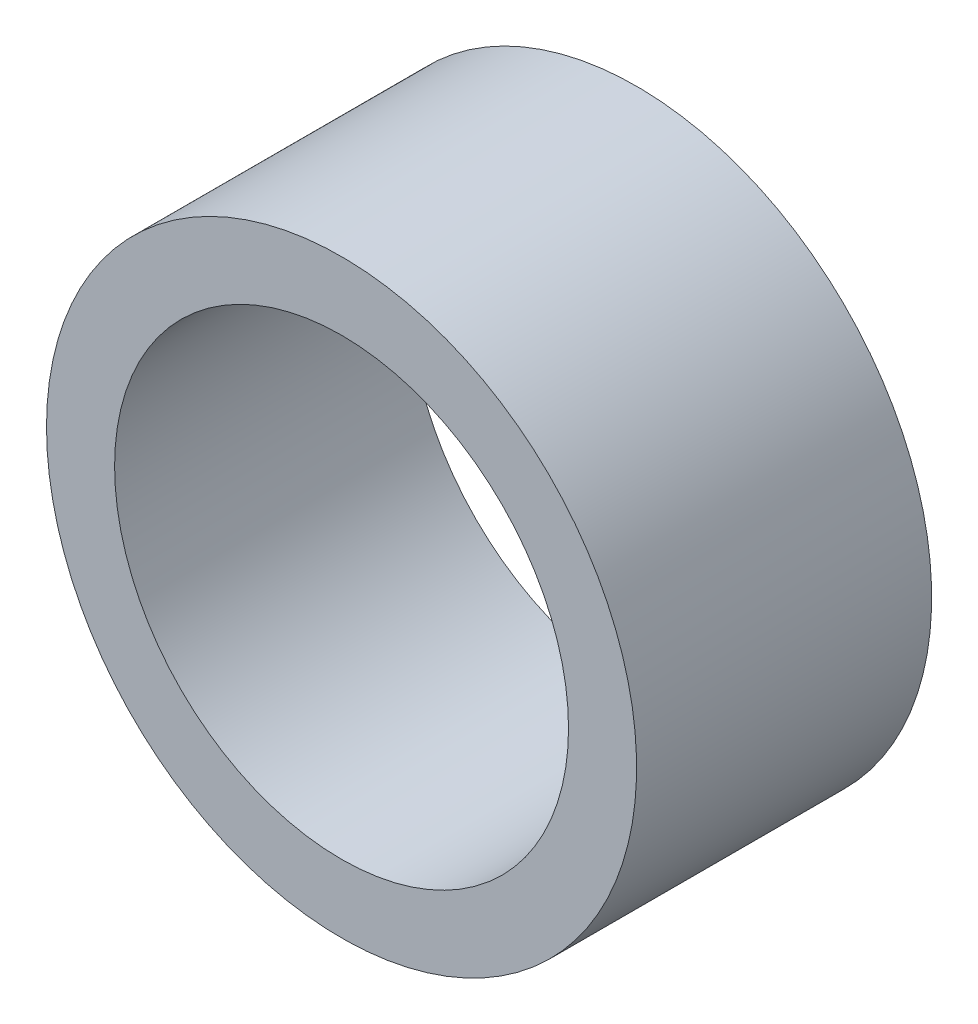
ISO-10303-21;
HEADER;
FILE_DESCRIPTION(('STEP AP214'),'2;1');
FILE_NAME('part.step','',(''),(''),'','','');
FILE_SCHEMA(('AUTOMOTIVE_DESIGN { 1 0 10303 214 1 1 1 1 }'));
ENDSEC;
DATA;
#1=APPLICATION_CONTEXT('core data for automotive mechanical design processes');
#2=APPLICATION_PROTOCOL_DEFINITION('international standard','automotive_design',2000,#1);
#3=PRODUCT_CONTEXT('',#1,'mechanical');
#4=PRODUCT('Part','Part','',(#3));
#5=PRODUCT_RELATED_PRODUCT_CATEGORY('part','',(#4));
#6=PRODUCT_DEFINITION_FORMATION('','',#4);
#7=PRODUCT_DEFINITION_CONTEXT('part definition',#1,'design');
#8=PRODUCT_DEFINITION('design','',#6,#7);
#9=PRODUCT_DEFINITION_SHAPE('','',#8);
#10=(LENGTH_UNIT() NAMED_UNIT(*) SI_UNIT(.MILLI.,.METRE.));
#11=(NAMED_UNIT(*) PLANE_ANGLE_UNIT() SI_UNIT($,.RADIAN.));
#12=(NAMED_UNIT(*) SI_UNIT($,.STERADIAN.) SOLID_ANGLE_UNIT());
#13=UNCERTAINTY_MEASURE_WITH_UNIT(LENGTH_MEASURE(1.E-05),#10,'distance_accuracy_value','');
#14=(GEOMETRIC_REPRESENTATION_CONTEXT(3) GLOBAL_UNCERTAINTY_ASSIGNED_CONTEXT((#13)) GLOBAL_UNIT_ASSIGNED_CONTEXT((#10,
#11,#12)) REPRESENTATION_CONTEXT('',''));
#15=CARTESIAN_POINT('',(0.,0.,0.));
#16=DIRECTION('',(0.,0.,1.));
#17=DIRECTION('',(1.,0.,0.));
#18=AXIS2_PLACEMENT_3D('',#15,#16,#17);
#19=CARTESIAN_POINT('',(0.,0.,26.));
#20=DIRECTION('',(0.,0.,1.));
#21=DIRECTION('',(1.,0.,0.));
#22=AXIS2_PLACEMENT_3D('',#19,#20,#21);
#23=PLANE('',#22);
#24=CARTESIAN_POINT('',(0.,0.,26.));
#25=DIRECTION('',(0.,0.,1.));
#26=DIRECTION('',(1.,0.,0.));
#27=AXIS2_PLACEMENT_3D('',#24,#25,#26);
#28=CIRCLE('',#27,26.);
#29=CARTESIAN_POINT('',(-26.,0.,26.));
#30=VERTEX_POINT('',#29);
#31=EDGE_CURVE('E10',#30,#30,#28,.T.);
#32=ORIENTED_EDGE('',*,*,#31,.T.);
#33=EDGE_LOOP('',(#32));
#34=FACE_BOUND('',#33,.T.);
#35=CARTESIAN_POINT('',(0.,0.,26.));
#36=DIRECTION('',(0.,0.,1.));
#37=DIRECTION('',(1.,0.,0.));
#38=AXIS2_PLACEMENT_3D('',#35,#36,#37);
#39=CIRCLE('',#38,20.);
#40=CARTESIAN_POINT('',(-20.,0.,26.));
#41=VERTEX_POINT('',#40);
#42=EDGE_CURVE('E42',#41,#41,#39,.T.);
#43=ORIENTED_EDGE('',*,*,#42,.F.);
#44=EDGE_LOOP('',(#43));
#45=FACE_BOUND('',#44,.T.);
#46=ADVANCED_FACE('F31',(#34,#45),#23,.T.);
#47=CARTESIAN_POINT('',(0.,0.,0.));
#48=DIRECTION('',(0.,0.,1.));
#49=DIRECTION('',(1.,0.,0.));
#50=AXIS2_PLACEMENT_3D('',#47,#48,#49);
#51=PLANE('',#50);
#52=CARTESIAN_POINT('',(0.,0.,0.));
#53=DIRECTION('',(0.,0.,1.));
#54=DIRECTION('',(1.,0.,0.));
#55=AXIS2_PLACEMENT_3D('',#52,#53,#54);
#56=CIRCLE('',#55,26.);
#57=CARTESIAN_POINT('',(-26.,0.,0.));
#58=VERTEX_POINT('',#57);
#59=EDGE_CURVE('E35',#58,#58,#56,.T.);
#60=ORIENTED_EDGE('',*,*,#59,.F.);
#61=EDGE_LOOP('',(#60));
#62=FACE_BOUND('',#61,.T.);
#63=CARTESIAN_POINT('',(0.,0.,0.));
#64=DIRECTION('',(0.,0.,1.));
#65=DIRECTION('',(1.,0.,0.));
#66=AXIS2_PLACEMENT_3D('',#63,#64,#65);
#67=CIRCLE('',#66,20.);
#68=CARTESIAN_POINT('',(-20.,0.,0.));
#69=VERTEX_POINT('',#68);
#70=EDGE_CURVE('E44',#69,#69,#67,.T.);
#71=ORIENTED_EDGE('',*,*,#70,.T.);
#72=EDGE_LOOP('',(#71));
#73=FACE_BOUND('',#72,.T.);
#74=ADVANCED_FACE('F54',(#62,#73),#51,.F.);
#75=CARTESIAN_POINT('',(0.,0.,26.));
#76=DIRECTION('',(0.,0.,-1.));
#77=DIRECTION('',(-1.,0.,0.));
#78=AXIS2_PLACEMENT_3D('',#75,#76,#77);
#79=CYLINDRICAL_SURFACE('',#78,26.);
#80=CARTESIAN_POINT('',(-26.,0.,26.));
#81=CARTESIAN_POINT('',(-26.,0.,25.7291666666667));
#82=CARTESIAN_POINT('',(-26.,0.,25.4583333333333));
#83=CARTESIAN_POINT('',(-26.,0.,24.9166666666667));
#84=CARTESIAN_POINT('',(-26.,0.,24.6458333333333));
#85=CARTESIAN_POINT('',(-26.,0.,24.1041666666667));
#86=CARTESIAN_POINT('',(-26.,0.,23.8333333333333));
#87=CARTESIAN_POINT('',(-26.,0.,23.2916666666667));
#88=CARTESIAN_POINT('',(-26.,0.,23.0208333333333));
#89=CARTESIAN_POINT('',(-26.,0.,22.4791666666667));
#90=CARTESIAN_POINT('',(-26.,0.,22.2083333333333));
#91=CARTESIAN_POINT('',(-26.,0.,21.6666666666667));
#92=CARTESIAN_POINT('',(-26.,0.,21.3958333333333));
#93=CARTESIAN_POINT('',(-26.,0.,20.8541666666667));
#94=CARTESIAN_POINT('',(-26.,0.,20.5833333333333));
#95=CARTESIAN_POINT('',(-26.,0.,20.0416666666667));
#96=CARTESIAN_POINT('',(-26.,0.,19.7708333333333));
#97=CARTESIAN_POINT('',(-26.,0.,19.2291666666667));
#98=CARTESIAN_POINT('',(-26.,0.,18.9583333333333));
#99=CARTESIAN_POINT('',(-26.,0.,18.4166666666667));
#100=CARTESIAN_POINT('',(-26.,0.,18.1458333333333));
#101=CARTESIAN_POINT('',(-26.,0.,17.6041666666667));
#102=CARTESIAN_POINT('',(-26.,0.,17.3333333333333));
#103=CARTESIAN_POINT('',(-26.,0.,16.7916666666667));
#104=CARTESIAN_POINT('',(-26.,0.,16.5208333333333));
#105=CARTESIAN_POINT('',(-26.,0.,15.9791666666667));
#106=CARTESIAN_POINT('',(-26.,0.,15.7083333333333));
#107=CARTESIAN_POINT('',(-26.,0.,15.1666666666667));
#108=CARTESIAN_POINT('',(-26.,0.,14.8958333333333));
#109=CARTESIAN_POINT('',(-26.,0.,14.3541666666667));
#110=CARTESIAN_POINT('',(-26.,0.,14.0833333333333));
#111=CARTESIAN_POINT('',(-26.,0.,13.5416666666667));
#112=CARTESIAN_POINT('',(-26.,0.,13.2708333333333));
#113=CARTESIAN_POINT('',(-26.,0.,12.7291666666667));
#114=CARTESIAN_POINT('',(-26.,0.,12.4583333333333));
#115=CARTESIAN_POINT('',(-26.,0.,11.9166666666667));
#116=CARTESIAN_POINT('',(-26.,0.,11.6458333333333));
#117=CARTESIAN_POINT('',(-26.,0.,11.1041666666667));
#118=CARTESIAN_POINT('',(-26.,0.,10.8333333333333));
#119=CARTESIAN_POINT('',(-26.,0.,10.2916666666667));
#120=CARTESIAN_POINT('',(-26.,0.,10.0208333333333));
#121=CARTESIAN_POINT('',(-26.,0.,9.47916666666667));
#122=CARTESIAN_POINT('',(-26.,0.,9.20833333333333));
#123=CARTESIAN_POINT('',(-26.,0.,8.66666666666667));
#124=CARTESIAN_POINT('',(-26.,0.,8.39583333333333));
#125=CARTESIAN_POINT('',(-26.,0.,7.85416666666667));
#126=CARTESIAN_POINT('',(-26.,0.,7.58333333333333));
#127=CARTESIAN_POINT('',(-26.,0.,7.04166666666667));
#128=CARTESIAN_POINT('',(-26.,0.,6.77083333333333));
#129=CARTESIAN_POINT('',(-26.,0.,6.22916666666667));
#130=CARTESIAN_POINT('',(-26.,0.,5.95833333333333));
#131=CARTESIAN_POINT('',(-26.,0.,5.41666666666667));
#132=CARTESIAN_POINT('',(-26.,0.,5.14583333333333));
#133=CARTESIAN_POINT('',(-26.,0.,4.60416666666667));
#134=CARTESIAN_POINT('',(-26.,0.,4.33333333333333));
#135=CARTESIAN_POINT('',(-26.,0.,3.79166666666667));
#136=CARTESIAN_POINT('',(-26.,0.,3.52083333333333));
#137=CARTESIAN_POINT('',(-26.,0.,2.97916666666667));
#138=CARTESIAN_POINT('',(-26.,0.,2.70833333333333));
#139=CARTESIAN_POINT('',(-26.,0.,2.16666666666667));
#140=CARTESIAN_POINT('',(-26.,0.,1.89583333333333));
#141=CARTESIAN_POINT('',(-26.,0.,1.35416666666667));
#142=CARTESIAN_POINT('',(-26.,0.,1.08333333333333));
#143=CARTESIAN_POINT('',(-26.,0.,0.541666666666667));
#144=CARTESIAN_POINT('',(-26.,0.,0.270833333333334));
#145=CARTESIAN_POINT('',(-26.,0.,0.));
#146=B_SPLINE_CURVE_WITH_KNOTS('',3,(#80,#81,#82,#83,#84,#85,#86,#87,#88,#89,#90,#91,#92,#93,
#94,#95,#96,#97,#98,#99,#100,#101,#102,#103,#104,#105,#106,#107,#108,#109,#110,#111,#112,#113,
#114,#115,#116,#117,#118,#119,#120,#121,#122,#123,#124,#125,#126,#127,#128,#129,#130,#131,#132,
#133,#134,#135,#136,#137,#138,#139,#140,#141,#142,#143,#144,#145),.UNSPECIFIED.,.F.,.F.,(4,2,2,
2,2,2,2,2,2,2,2,2,2,2,2,2,2,2,2,2,2,2,2,2,2,2,2,2,2,2,2,2,4),(0.,0.812499999999997,1.625,2.4375,
3.25,4.0625,4.875,5.6875,6.5,7.3125,8.125,8.93749999999999,9.74999999999999,10.5625,11.375,
12.1875,13.,13.8125,14.625,15.4375,16.25,17.0625,17.875,18.6875,19.5,20.3125,21.125,21.9375,
22.75,23.5625,24.375,25.1875,26.),.UNSPECIFIED.);
#147=EDGE_CURVE('BSEAM33',#30,#58,#146,.T.);
#148=ORIENTED_EDGE('',*,*,#31,.F.);
#149=ORIENTED_EDGE('',*,*,#59,.T.);
#150=ORIENTED_EDGE('',*,*,#147,.T.);
#151=ORIENTED_EDGE('',*,*,#147,.F.);
#152=EDGE_LOOP('',(#148,#150,#149,#151));
#153=FACE_BOUND('',#152,.T.);
#154=ADVANCED_FACE('F33',(#153),#79,.T.);
#155=CARTESIAN_POINT('',(0.,0.,26.));
#156=DIRECTION('',(0.,0.,-1.));
#157=DIRECTION('',(-1.,0.,0.));
#158=AXIS2_PLACEMENT_3D('',#155,#156,#157);
#159=CYLINDRICAL_SURFACE('',#158,20.);
#160=CARTESIAN_POINT('',(-20.,0.,26.));
#161=CARTESIAN_POINT('',(-20.,0.,25.7291666666667));
#162=CARTESIAN_POINT('',(-20.,0.,25.4583333333333));
#163=CARTESIAN_POINT('',(-20.,0.,24.9166666666667));
#164=CARTESIAN_POINT('',(-20.,0.,24.6458333333333));
#165=CARTESIAN_POINT('',(-20.,0.,24.1041666666667));
#166=CARTESIAN_POINT('',(-20.,0.,23.8333333333333));
#167=CARTESIAN_POINT('',(-20.,0.,23.2916666666667));
#168=CARTESIAN_POINT('',(-20.,0.,23.0208333333333));
#169=CARTESIAN_POINT('',(-20.,0.,22.4791666666667));
#170=CARTESIAN_POINT('',(-20.,0.,22.2083333333333));
#171=CARTESIAN_POINT('',(-20.,0.,21.6666666666667));
#172=CARTESIAN_POINT('',(-20.,0.,21.3958333333333));
#173=CARTESIAN_POINT('',(-20.,0.,20.8541666666667));
#174=CARTESIAN_POINT('',(-20.,0.,20.5833333333333));
#175=CARTESIAN_POINT('',(-20.,0.,20.0416666666667));
#176=CARTESIAN_POINT('',(-20.,0.,19.7708333333333));
#177=CARTESIAN_POINT('',(-20.,0.,19.2291666666667));
#178=CARTESIAN_POINT('',(-20.,0.,18.9583333333333));
#179=CARTESIAN_POINT('',(-20.,0.,18.4166666666667));
#180=CARTESIAN_POINT('',(-20.,0.,18.1458333333333));
#181=CARTESIAN_POINT('',(-20.,0.,17.6041666666667));
#182=CARTESIAN_POINT('',(-20.,0.,17.3333333333333));
#183=CARTESIAN_POINT('',(-20.,0.,16.7916666666667));
#184=CARTESIAN_POINT('',(-20.,0.,16.5208333333333));
#185=CARTESIAN_POINT('',(-20.,0.,15.9791666666667));
#186=CARTESIAN_POINT('',(-20.,0.,15.7083333333333));
#187=CARTESIAN_POINT('',(-20.,0.,15.1666666666667));
#188=CARTESIAN_POINT('',(-20.,0.,14.8958333333333));
#189=CARTESIAN_POINT('',(-20.,0.,14.3541666666667));
#190=CARTESIAN_POINT('',(-20.,0.,14.0833333333333));
#191=CARTESIAN_POINT('',(-20.,0.,13.5416666666667));
#192=CARTESIAN_POINT('',(-20.,0.,13.2708333333333));
#193=CARTESIAN_POINT('',(-20.,0.,12.7291666666667));
#194=CARTESIAN_POINT('',(-20.,0.,12.4583333333333));
#195=CARTESIAN_POINT('',(-20.,0.,11.9166666666667));
#196=CARTESIAN_POINT('',(-20.,0.,11.6458333333333));
#197=CARTESIAN_POINT('',(-20.,0.,11.1041666666667));
#198=CARTESIAN_POINT('',(-20.,0.,10.8333333333333));
#199=CARTESIAN_POINT('',(-20.,0.,10.2916666666667));
#200=CARTESIAN_POINT('',(-20.,0.,10.0208333333333));
#201=CARTESIAN_POINT('',(-20.,0.,9.47916666666667));
#202=CARTESIAN_POINT('',(-20.,0.,9.20833333333333));
#203=CARTESIAN_POINT('',(-20.,0.,8.66666666666667));
#204=CARTESIAN_POINT('',(-20.,0.,8.39583333333333));
#205=CARTESIAN_POINT('',(-20.,0.,7.85416666666667));
#206=CARTESIAN_POINT('',(-20.,0.,7.58333333333333));
#207=CARTESIAN_POINT('',(-20.,0.,7.04166666666667));
#208=CARTESIAN_POINT('',(-20.,0.,6.77083333333333));
#209=CARTESIAN_POINT('',(-20.,0.,6.22916666666667));
#210=CARTESIAN_POINT('',(-20.,0.,5.95833333333333));
#211=CARTESIAN_POINT('',(-20.,0.,5.41666666666667));
#212=CARTESIAN_POINT('',(-20.,0.,5.14583333333333));
#213=CARTESIAN_POINT('',(-20.,0.,4.60416666666667));
#214=CARTESIAN_POINT('',(-20.,0.,4.33333333333333));
#215=CARTESIAN_POINT('',(-20.,0.,3.79166666666667));
#216=CARTESIAN_POINT('',(-20.,0.,3.52083333333333));
#217=CARTESIAN_POINT('',(-20.,0.,2.97916666666667));
#218=CARTESIAN_POINT('',(-20.,0.,2.70833333333333));
#219=CARTESIAN_POINT('',(-20.,0.,2.16666666666667));
#220=CARTESIAN_POINT('',(-20.,0.,1.89583333333333));
#221=CARTESIAN_POINT('',(-20.,0.,1.35416666666667));
#222=CARTESIAN_POINT('',(-20.,0.,1.08333333333333));
#223=CARTESIAN_POINT('',(-20.,0.,0.541666666666667));
#224=CARTESIAN_POINT('',(-20.,0.,0.270833333333334));
#225=CARTESIAN_POINT('',(-20.,0.,0.));
#226=B_SPLINE_CURVE_WITH_KNOTS('',3,(#160,#161,#162,#163,#164,#165,#166,#167,#168,#169,#170,
#171,#172,#173,#174,#175,#176,#177,#178,#179,#180,#181,#182,#183,#184,#185,#186,#187,#188,#189,
#190,#191,#192,#193,#194,#195,#196,#197,#198,#199,#200,#201,#202,#203,#204,#205,#206,#207,#208,
#209,#210,#211,#212,#213,#214,#215,#216,#217,#218,#219,#220,#221,#222,#223,#224,#225),
.UNSPECIFIED.,.F.,.F.,(4,2,2,2,2,2,2,2,2,2,2,2,2,2,2,2,2,2,2,2,2,2,2,2,2,2,2,2,2,2,2,2,4),(0.,
0.812500000000001,1.625,2.4375,3.25,4.0625,4.875,5.6875,6.5,7.3125,8.125,8.9375,9.75,10.5625,
11.375,12.1875,13.,13.8125,14.625,15.4375,16.25,17.0625,17.875,18.6875,19.5,20.3125,21.125,
21.9375,22.75,23.5625,24.375,25.1875,26.),.UNSPECIFIED.);
#227=EDGE_CURVE('BSEAM50',#41,#69,#226,.T.);
#228=ORIENTED_EDGE('',*,*,#42,.T.);
#229=ORIENTED_EDGE('',*,*,#70,.F.);
#230=ORIENTED_EDGE('',*,*,#227,.T.);
#231=ORIENTED_EDGE('',*,*,#227,.F.);
#232=EDGE_LOOP('',(#228,#230,#229,#231));
#233=FACE_BOUND('',#232,.T.);
#234=ADVANCED_FACE('F50',(#233),#159,.F.);
#235=CLOSED_SHELL('',(#46,#74,#154,#234));
#236=MANIFOLD_SOLID_BREP('B2',#235);
#237=ADVANCED_BREP_SHAPE_REPRESENTATION('',(#18,#236),#14);
#238=SHAPE_DEFINITION_REPRESENTATION(#9,#237);
ENDSEC;
END-ISO-10303-21;
